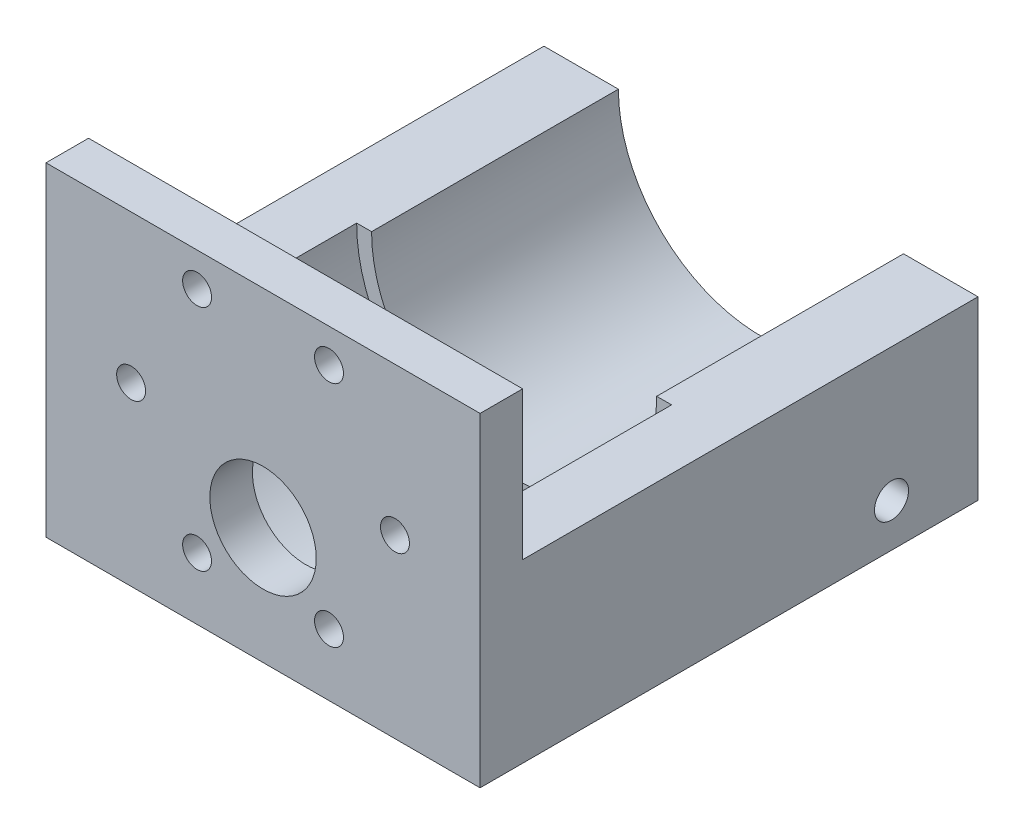
ISO-10303-21;
HEADER;
FILE_DESCRIPTION(('STEP AP214'),'2;1');
FILE_NAME('part.step','',(''),(''),'','','');
FILE_SCHEMA(('AUTOMOTIVE_DESIGN { 1 0 10303 214 1 1 1 1 }'));
ENDSEC;
DATA;
#1=APPLICATION_CONTEXT('core data for automotive mechanical design processes');
#2=APPLICATION_PROTOCOL_DEFINITION('international standard','automotive_design',2000,#1);
#3=PRODUCT_CONTEXT('',#1,'mechanical');
#4=PRODUCT('Part','Part','',(#3));
#5=PRODUCT_RELATED_PRODUCT_CATEGORY('part','',(#4));
#6=PRODUCT_DEFINITION_FORMATION('','',#4);
#7=PRODUCT_DEFINITION_CONTEXT('part definition',#1,'design');
#8=PRODUCT_DEFINITION('design','',#6,#7);
#9=PRODUCT_DEFINITION_SHAPE('','',#8);
#10=(LENGTH_UNIT() NAMED_UNIT(*) SI_UNIT(.MILLI.,.METRE.));
#11=(NAMED_UNIT(*) PLANE_ANGLE_UNIT() SI_UNIT($,.RADIAN.));
#12=(NAMED_UNIT(*) SI_UNIT($,.STERADIAN.) SOLID_ANGLE_UNIT());
#13=UNCERTAINTY_MEASURE_WITH_UNIT(LENGTH_MEASURE(1.E-05),#10,'distance_accuracy_value','');
#14=(GEOMETRIC_REPRESENTATION_CONTEXT(3) GLOBAL_UNCERTAINTY_ASSIGNED_CONTEXT((#13)) GLOBAL_UNIT_ASSIGNED_CONTEXT((#10,
#11,#12)) REPRESENTATION_CONTEXT('',''));
#15=CARTESIAN_POINT('',(0.,0.,0.));
#16=DIRECTION('',(0.,0.,1.));
#17=DIRECTION('',(1.,0.,0.));
#18=AXIS2_PLACEMENT_3D('',#15,#16,#17);
#19=CARTESIAN_POINT('',(0.,0.,24.500000006));
#20=DIRECTION('',(0.,0.,-1.));
#21=DIRECTION('',(-1.,0.,0.));
#22=AXIS2_PLACEMENT_3D('',#19,#20,#21);
#23=CYLINDRICAL_SURFACE('',#22,18.5);
#24=CARTESIAN_POINT('',(0.,0.,0.));
#25=DIRECTION('',(0.,0.,-1.));
#26=DIRECTION('',(1.,0.,0.));
#27=AXIS2_PLACEMENT_3D('',#24,#25,#26);
#28=CIRCLE('',#27,18.5);
#29=CARTESIAN_POINT('',(18.5,0.,0.));
#30=VERTEX_POINT('',#29);
#31=CARTESIAN_POINT('',(-18.5,0.,0.));
#32=VERTEX_POINT('',#31);
#33=EDGE_CURVE('E203',#30,#32,#28,.T.);
#34=ORIENTED_EDGE('',*,*,#33,.T.);
#35=DIRECTION('',(0.,0.,-1.));
#36=VECTOR('',#35,1.);
#37=CARTESIAN_POINT('',(-18.5,0.,24.500000006));
#38=LINE('',#37,#36);
#39=CARTESIAN_POINT('',(-18.5,0.,24.500000006));
#40=VERTEX_POINT('',#39);
#41=EDGE_CURVE('E11',#40,#32,#38,.T.);
#42=ORIENTED_EDGE('',*,*,#41,.F.);
#43=CARTESIAN_POINT('',(0.,0.,24.500000006));
#44=DIRECTION('',(0.,0.,-1.));
#45=DIRECTION('',(1.,0.,0.));
#46=AXIS2_PLACEMENT_3D('',#43,#44,#45);
#47=CIRCLE('',#46,18.5);
#48=CARTESIAN_POINT('',(18.5,0.,24.500000006));
#49=VERTEX_POINT('',#48);
#50=EDGE_CURVE('E204',#49,#40,#47,.T.);
#51=ORIENTED_EDGE('',*,*,#50,.F.);
#52=DIRECTION('',(0.,0.,-1.));
#53=VECTOR('',#52,1.);
#54=CARTESIAN_POINT('',(18.5,0.,24.500000006));
#55=LINE('',#54,#53);
#56=EDGE_CURVE('E213',#49,#30,#55,.T.);
#57=ORIENTED_EDGE('',*,*,#56,.T.);
#58=EDGE_LOOP('',(#34,#42,#51,#57));
#59=FACE_BOUND('',#58,.T.);
#60=ADVANCED_FACE('F37',(#59),#23,.F.);
#61=CARTESIAN_POINT('',(-25.5,0.,24.500000006));
#62=DIRECTION('',(0.,-1.,0.));
#63=DIRECTION('',(0.,0.,-1.));
#64=AXIS2_PLACEMENT_3D('',#61,#62,#63);
#65=PLANE('',#64);
#66=ORIENTED_EDGE('',*,*,#41,.T.);
#67=DIRECTION('',(1.,0.,0.));
#68=VECTOR('',#67,1.);
#69=CARTESIAN_POINT('',(-16.75,0.,0.));
#70=LINE('',#69,#68);
#71=CARTESIAN_POINT('',(-16.75,0.,0.));
#72=VERTEX_POINT('',#71);
#73=EDGE_CURVE('E128',#32,#72,#70,.T.);
#74=ORIENTED_EDGE('',*,*,#73,.T.);
#75=DIRECTION('',(0.,0.,1.));
#76=VECTOR('',#75,1.);
#77=CARTESIAN_POINT('',(-16.75,0.,-29.));
#78=LINE('',#77,#76);
#79=CARTESIAN_POINT('',(-16.75,0.,-29.));
#80=VERTEX_POINT('',#79);
#81=EDGE_CURVE('E134',#80,#72,#78,.T.);
#82=ORIENTED_EDGE('',*,*,#81,.F.);
#83=DIRECTION('',(1.,0.,0.));
#84=VECTOR('',#83,1.);
#85=CARTESIAN_POINT('',(-16.75,0.,-29.));
#86=LINE('',#85,#84);
#87=CARTESIAN_POINT('',(-25.5,0.,-29.));
#88=VERTEX_POINT('',#87);
#89=EDGE_CURVE('E124',#88,#80,#86,.T.);
#90=ORIENTED_EDGE('',*,*,#89,.F.);
#91=DIRECTION('',(0.,0.,-1.));
#92=VECTOR('',#91,1.);
#93=CARTESIAN_POINT('',(-25.5,0.,24.500000006));
#94=LINE('',#93,#92);
#95=CARTESIAN_POINT('',(-25.5,0.,24.500000006));
#96=VERTEX_POINT('',#95);
#97=EDGE_CURVE('E45',#96,#88,#94,.T.);
#98=ORIENTED_EDGE('',*,*,#97,.F.);
#99=DIRECTION('',(-1.,0.,0.));
#100=VECTOR('',#99,1.);
#101=CARTESIAN_POINT('',(-25.5,0.,24.500000006));
#102=LINE('',#101,#100);
#103=EDGE_CURVE('E207',#40,#96,#102,.T.);
#104=ORIENTED_EDGE('',*,*,#103,.F.);
#105=EDGE_LOOP('',(#66,#74,#82,#90,#98,#104));
#106=FACE_BOUND('',#105,.T.);
#107=ADVANCED_FACE('F232',(#106),#65,.F.);
#108=CARTESIAN_POINT('',(-25.5,-20.716,24.500000006));
#109=DIRECTION('',(1.,0.,0.));
#110=DIRECTION('',(0.,0.,-1.));
#111=AXIS2_PLACEMENT_3D('',#108,#109,#110);
#112=PLANE('',#111);
#113=CARTESIAN_POINT('',(-25.5,-15.636,-18.84));
#114=DIRECTION('',(-1.,0.,0.));
#115=DIRECTION('',(0.,0.,1.));
#116=AXIS2_PLACEMENT_3D('',#113,#114,#115);
#117=CIRCLE('',#116,2.000000064);
#118=CARTESIAN_POINT('',(-25.5,-15.636,-16.839999936));
#119=VERTEX_POINT('',#118);
#120=EDGE_CURVE('E289',#119,#119,#117,.T.);
#121=ORIENTED_EDGE('',*,*,#120,.F.);
#122=EDGE_LOOP('',(#121));
#123=FACE_BOUND('',#122,.T.);
#124=ORIENTED_EDGE('',*,*,#97,.T.);
#125=DIRECTION('',(0.,1.,0.));
#126=VECTOR('',#125,1.);
#127=CARTESIAN_POINT('',(-25.5,0.,-29.));
#128=LINE('',#127,#126);
#129=CARTESIAN_POINT('',(-25.5,-20.716,-29.));
#130=VERTEX_POINT('',#129);
#131=EDGE_CURVE('E225',#130,#88,#128,.T.);
#132=ORIENTED_EDGE('',*,*,#131,.F.);
#133=DIRECTION('',(0.,0.,-1.));
#134=VECTOR('',#133,1.);
#135=CARTESIAN_POINT('',(-25.5,-20.716,24.500000006));
#136=LINE('',#135,#134);
#137=CARTESIAN_POINT('',(-25.5,-20.716,29.500000006));
#138=VERTEX_POINT('',#137);
#139=EDGE_CURVE('E221',#138,#130,#136,.T.);
#140=ORIENTED_EDGE('',*,*,#139,.F.);
#141=DIRECTION('',(0.,-1.,0.));
#142=VECTOR('',#141,1.);
#143=CARTESIAN_POINT('',(-25.5,-20.716,29.500000006));
#144=LINE('',#143,#142);
#145=CARTESIAN_POINT('',(-25.5,17.384,29.500000006));
#146=VERTEX_POINT('',#145);
#147=EDGE_CURVE('E181',#146,#138,#144,.T.);
#148=ORIENTED_EDGE('',*,*,#147,.F.);
#149=DIRECTION('',(0.,0.,-1.));
#150=VECTOR('',#149,1.);
#151=CARTESIAN_POINT('',(-25.5,17.384,29.500000006));
#152=LINE('',#151,#150);
#153=CARTESIAN_POINT('',(-25.5,17.384,24.500000006));
#154=VERTEX_POINT('',#153);
#155=EDGE_CURVE('E192',#146,#154,#152,.T.);
#156=ORIENTED_EDGE('',*,*,#155,.T.);
#157=DIRECTION('',(0.,-1.,0.));
#158=VECTOR('',#157,1.);
#159=CARTESIAN_POINT('',(-25.5,-20.716,24.500000006));
#160=LINE('',#159,#158);
#161=EDGE_CURVE('E178',#154,#96,#160,.T.);
#162=ORIENTED_EDGE('',*,*,#161,.T.);
#163=EDGE_LOOP('',(#124,#132,#140,#148,#156,#162));
#164=FACE_BOUND('',#163,.T.);
#165=ADVANCED_FACE('F224',(#123,#164),#112,.F.);
#166=CARTESIAN_POINT('',(25.5,-20.716,24.500000006));
#167=DIRECTION('',(0.,1.,0.));
#168=DIRECTION('',(-1.,0.,0.));
#169=AXIS2_PLACEMENT_3D('',#166,#167,#168);
#170=PLANE('',#169);
#171=CARTESIAN_POINT('',(21.69,-20.716,25.690000006));
#172=DIRECTION('',(0.,-1.,0.));
#173=DIRECTION('',(1.,0.,0.));
#174=AXIS2_PLACEMENT_3D('',#171,#172,#173);
#175=CIRCLE('',#174,2.000000064);
#176=CARTESIAN_POINT('',(23.690000064,-20.716,25.690000006));
#177=VERTEX_POINT('',#176);
#178=EDGE_CURVE('E268',#177,#177,#175,.T.);
#179=ORIENTED_EDGE('',*,*,#178,.F.);
#180=EDGE_LOOP('',(#179));
#181=FACE_BOUND('',#180,.T.);
#182=CARTESIAN_POINT('',(-21.69,-20.716,-25.19));
#183=DIRECTION('',(0.,-1.,0.));
#184=DIRECTION('',(1.,0.,0.));
#185=AXIS2_PLACEMENT_3D('',#182,#183,#184);
#186=CIRCLE('',#185,2.000000064);
#187=CARTESIAN_POINT('',(-19.689999936,-20.716,-25.19));
#188=VERTEX_POINT('',#187);
#189=EDGE_CURVE('E274',#188,#188,#186,.T.);
#190=ORIENTED_EDGE('',*,*,#189,.F.);
#191=EDGE_LOOP('',(#190));
#192=FACE_BOUND('',#191,.T.);
#193=CARTESIAN_POINT('',(21.69,-20.716,-25.19));
#194=DIRECTION('',(0.,-1.,0.));
#195=DIRECTION('',(1.,0.,0.));
#196=AXIS2_PLACEMENT_3D('',#193,#194,#195);
#197=CIRCLE('',#196,2.000000064);
#198=CARTESIAN_POINT('',(23.690000064,-20.716,-25.19));
#199=VERTEX_POINT('',#198);
#200=EDGE_CURVE('E275',#199,#199,#197,.T.);
#201=ORIENTED_EDGE('',*,*,#200,.F.);
#202=EDGE_LOOP('',(#201));
#203=FACE_BOUND('',#202,.T.);
#204=CARTESIAN_POINT('',(-21.69,-20.716,25.690000006));
#205=DIRECTION('',(0.,-1.,0.));
#206=DIRECTION('',(1.,0.,0.));
#207=AXIS2_PLACEMENT_3D('',#204,#205,#206);
#208=CIRCLE('',#207,2.000000064);
#209=CARTESIAN_POINT('',(-19.689999936,-20.716,25.690000006));
#210=VERTEX_POINT('',#209);
#211=EDGE_CURVE('E265',#210,#210,#208,.T.);
#212=ORIENTED_EDGE('',*,*,#211,.F.);
#213=EDGE_LOOP('',(#212));
#214=FACE_BOUND('',#213,.T.);
#215=ORIENTED_EDGE('',*,*,#139,.T.);
#216=DIRECTION('',(-1.,0.,0.));
#217=VECTOR('',#216,1.);
#218=CARTESIAN_POINT('',(-25.5,-20.716,-29.));
#219=LINE('',#218,#217);
#220=CARTESIAN_POINT('',(25.5,-20.716,-29.));
#221=VERTEX_POINT('',#220);
#222=EDGE_CURVE('E230',#221,#130,#219,.T.);
#223=ORIENTED_EDGE('',*,*,#222,.F.);
#224=DIRECTION('',(0.,0.,-1.));
#225=VECTOR('',#224,1.);
#226=CARTESIAN_POINT('',(25.5,-20.716,24.500000006));
#227=LINE('',#226,#225);
#228=CARTESIAN_POINT('',(25.5,-20.716,29.500000006));
#229=VERTEX_POINT('',#228);
#230=EDGE_CURVE('E219',#229,#221,#227,.T.);
#231=ORIENTED_EDGE('',*,*,#230,.F.);
#232=DIRECTION('',(1.,0.,0.));
#233=VECTOR('',#232,1.);
#234=CARTESIAN_POINT('',(-25.5,-20.716,29.500000006));
#235=LINE('',#234,#233);
#236=EDGE_CURVE('E184',#138,#229,#235,.T.);
#237=ORIENTED_EDGE('',*,*,#236,.F.);
#238=EDGE_LOOP('',(#215,#223,#231,#237));
#239=FACE_BOUND('',#238,.T.);
#240=ADVANCED_FACE('F263',(#181,#192,#203,#214,#239),#170,.F.);
#241=CARTESIAN_POINT('',(25.5,0.,24.500000006));
#242=DIRECTION('',(-1.,0.,0.));
#243=DIRECTION('',(0.,-1.,0.));
#244=AXIS2_PLACEMENT_3D('',#241,#242,#243);
#245=PLANE('',#244);
#246=CARTESIAN_POINT('',(25.5,-15.636,-18.84));
#247=DIRECTION('',(1.,0.,0.));
#248=DIRECTION('',(0.,1.,0.));
#249=AXIS2_PLACEMENT_3D('',#246,#247,#248);
#250=CIRCLE('',#249,2.000000064);
#251=CARTESIAN_POINT('',(25.5,-13.635999936,-18.84));
#252=VERTEX_POINT('',#251);
#253=EDGE_CURVE('E295',#252,#252,#250,.T.);
#254=ORIENTED_EDGE('',*,*,#253,.F.);
#255=EDGE_LOOP('',(#254));
#256=FACE_BOUND('',#255,.T.);
#257=ORIENTED_EDGE('',*,*,#230,.T.);
#258=DIRECTION('',(0.,-1.,0.));
#259=VECTOR('',#258,1.);
#260=CARTESIAN_POINT('',(25.5,-20.716,-29.));
#261=LINE('',#260,#259);
#262=CARTESIAN_POINT('',(25.5,0.,-29.));
#263=VERTEX_POINT('',#262);
#264=EDGE_CURVE('E117',#263,#221,#261,.T.);
#265=ORIENTED_EDGE('',*,*,#264,.F.);
#266=DIRECTION('',(0.,0.,-1.));
#267=VECTOR('',#266,1.);
#268=CARTESIAN_POINT('',(25.5,0.,24.500000006));
#269=LINE('',#268,#267);
#270=CARTESIAN_POINT('',(25.5,0.,24.500000006));
#271=VERTEX_POINT('',#270);
#272=EDGE_CURVE('E52',#271,#263,#269,.T.);
#273=ORIENTED_EDGE('',*,*,#272,.F.);
#274=DIRECTION('',(0.,1.,0.));
#275=VECTOR('',#274,1.);
#276=CARTESIAN_POINT('',(25.5,-20.716,24.500000006));
#277=LINE('',#276,#275);
#278=CARTESIAN_POINT('',(25.5,17.384,24.500000006));
#279=VERTEX_POINT('',#278);
#280=EDGE_CURVE('E195',#271,#279,#277,.T.);
#281=ORIENTED_EDGE('',*,*,#280,.T.);
#282=DIRECTION('',(0.,0.,-1.));
#283=VECTOR('',#282,1.);
#284=CARTESIAN_POINT('',(25.5,17.384,29.500000006));
#285=LINE('',#284,#283);
#286=CARTESIAN_POINT('',(25.5,17.384,29.500000006));
#287=VERTEX_POINT('',#286);
#288=EDGE_CURVE('E200',#287,#279,#285,.T.);
#289=ORIENTED_EDGE('',*,*,#288,.F.);
#290=DIRECTION('',(0.,1.,0.));
#291=VECTOR('',#290,1.);
#292=CARTESIAN_POINT('',(25.5,-20.716,29.500000006));
#293=LINE('',#292,#291);
#294=EDGE_CURVE('E188',#229,#287,#293,.T.);
#295=ORIENTED_EDGE('',*,*,#294,.F.);
#296=EDGE_LOOP('',(#257,#265,#273,#281,#289,#295));
#297=FACE_BOUND('',#296,.T.);
#298=ADVANCED_FACE('F250',(#256,#297),#245,.F.);
#299=CARTESIAN_POINT('',(18.5,0.,24.500000006));
#300=DIRECTION('',(0.,-1.,0.));
#301=DIRECTION('',(0.,0.,-1.));
#302=AXIS2_PLACEMENT_3D('',#299,#300,#301);
#303=PLANE('',#302);
#304=ORIENTED_EDGE('',*,*,#272,.T.);
#305=DIRECTION('',(1.,0.,0.));
#306=VECTOR('',#305,1.);
#307=CARTESIAN_POINT('',(25.5,0.,-29.));
#308=LINE('',#307,#306);
#309=CARTESIAN_POINT('',(16.75,0.,-29.));
#310=VERTEX_POINT('',#309);
#311=EDGE_CURVE('E108',#310,#263,#308,.T.);
#312=ORIENTED_EDGE('',*,*,#311,.F.);
#313=DIRECTION('',(0.,0.,1.));
#314=VECTOR('',#313,1.);
#315=CARTESIAN_POINT('',(16.75,0.,-29.));
#316=LINE('',#315,#314);
#317=CARTESIAN_POINT('',(16.75,0.,0.));
#318=VERTEX_POINT('',#317);
#319=EDGE_CURVE('E113',#310,#318,#316,.T.);
#320=ORIENTED_EDGE('',*,*,#319,.T.);
#321=DIRECTION('',(1.,0.,0.));
#322=VECTOR('',#321,1.);
#323=CARTESIAN_POINT('',(25.5,0.,0.));
#324=LINE('',#323,#322);
#325=EDGE_CURVE('E237',#318,#30,#324,.T.);
#326=ORIENTED_EDGE('',*,*,#325,.T.);
#327=ORIENTED_EDGE('',*,*,#56,.F.);
#328=DIRECTION('',(-1.,0.,0.));
#329=VECTOR('',#328,1.);
#330=CARTESIAN_POINT('',(18.5,0.,24.500000006));
#331=LINE('',#330,#329);
#332=EDGE_CURVE('E210',#271,#49,#331,.T.);
#333=ORIENTED_EDGE('',*,*,#332,.F.);
#334=EDGE_LOOP('',(#304,#312,#320,#326,#327,#333));
#335=FACE_BOUND('',#334,.T.);
#336=ADVANCED_FACE('F110',(#335),#303,.F.);
#337=CARTESIAN_POINT('',(0.,0.,24.500000006));
#338=DIRECTION('',(0.,0.,1.));
#339=DIRECTION('',(1.,0.,0.));
#340=AXIS2_PLACEMENT_3D('',#337,#338,#339);
#341=PLANE('',#340);
#342=CARTESIAN_POINT('',(0.,-7.00000000000001,24.500000006));
#343=DIRECTION('',(0.,0.,1.));
#344=DIRECTION('',(1.,0.,0.));
#345=AXIS2_PLACEMENT_3D('',#342,#343,#344);
#346=CIRCLE('',#345,6.25);
#347=CARTESIAN_POINT('',(6.25,-7.00000000000001,24.500000006));
#348=VERTEX_POINT('',#347);
#349=EDGE_CURVE('E172',#348,#348,#346,.T.);
#350=ORIENTED_EDGE('',*,*,#349,.T.);
#351=EDGE_LOOP('',(#350));
#352=FACE_BOUND('',#351,.T.);
#353=CARTESIAN_POINT('',(15.5,0.,24.500000006));
#354=DIRECTION('',(0.,0.,1.));
#355=DIRECTION('',(1.,0.,0.));
#356=AXIS2_PLACEMENT_3D('',#353,#354,#355);
#357=CIRCLE('',#356,1.7);
#358=CARTESIAN_POINT('',(17.2,0.,24.500000006));
#359=VERTEX_POINT('',#358);
#360=EDGE_CURVE('E166',#359,#359,#357,.T.);
#361=ORIENTED_EDGE('',*,*,#360,.T.);
#362=EDGE_LOOP('',(#361));
#363=FACE_BOUND('',#362,.T.);
#364=CARTESIAN_POINT('',(-15.5,0.,24.500000006));
#365=DIRECTION('',(0.,0.,1.));
#366=DIRECTION('',(1.,0.,0.));
#367=AXIS2_PLACEMENT_3D('',#364,#365,#366);
#368=CIRCLE('',#367,1.7);
#369=CARTESIAN_POINT('',(-13.8,0.,24.500000006));
#370=VERTEX_POINT('',#369);
#371=EDGE_CURVE('E160',#370,#370,#368,.T.);
#372=ORIENTED_EDGE('',*,*,#371,.T.);
#373=EDGE_LOOP('',(#372));
#374=FACE_BOUND('',#373,.T.);
#375=CARTESIAN_POINT('',(-7.75000000000006,-13.4233937586588,24.500000006));
#376=DIRECTION('',(0.,0.,1.));
#377=DIRECTION('',(1.,0.,0.));
#378=AXIS2_PLACEMENT_3D('',#375,#376,#377);
#379=CIRCLE('',#378,1.7);
#380=CARTESIAN_POINT('',(-6.05000000000006,-13.4233937586588,24.500000006));
#381=VERTEX_POINT('',#380);
#382=EDGE_CURVE('E154',#381,#381,#379,.T.);
#383=ORIENTED_EDGE('',*,*,#382,.T.);
#384=EDGE_LOOP('',(#383));
#385=FACE_BOUND('',#384,.T.);
#386=CARTESIAN_POINT('',(-7.74999999999987,13.4233937586589,24.500000006));
#387=DIRECTION('',(0.,0.,1.));
#388=DIRECTION('',(1.,0.,0.));
#389=AXIS2_PLACEMENT_3D('',#386,#387,#388);
#390=CIRCLE('',#389,1.7);
#391=CARTESIAN_POINT('',(-6.04999999999987,13.4233937586589,24.500000006));
#392=VERTEX_POINT('',#391);
#393=EDGE_CURVE('E148',#392,#392,#390,.T.);
#394=ORIENTED_EDGE('',*,*,#393,.T.);
#395=EDGE_LOOP('',(#394));
#396=FACE_BOUND('',#395,.T.);
#397=CARTESIAN_POINT('',(7.75000000000006,13.4233937586588,24.500000006));
#398=DIRECTION('',(0.,0.,1.));
#399=DIRECTION('',(1.,0.,0.));
#400=AXIS2_PLACEMENT_3D('',#397,#398,#399);
#401=CIRCLE('',#400,1.7);
#402=CARTESIAN_POINT('',(9.45000000000006,13.4233937586588,24.500000006));
#403=VERTEX_POINT('',#402);
#404=EDGE_CURVE('E143',#403,#403,#401,.T.);
#405=ORIENTED_EDGE('',*,*,#404,.T.);
#406=EDGE_LOOP('',(#405));
#407=FACE_BOUND('',#406,.T.);
#408=CARTESIAN_POINT('',(7.74999999999987,-13.4233937586589,24.500000006));
#409=DIRECTION('',(0.,0.,1.));
#410=DIRECTION('',(1.,0.,0.));
#411=AXIS2_PLACEMENT_3D('',#408,#409,#410);
#412=CIRCLE('',#411,1.7);
#413=CARTESIAN_POINT('',(9.44999999999987,-13.4233937586589,24.500000006));
#414=VERTEX_POINT('',#413);
#415=EDGE_CURVE('E133',#414,#414,#412,.T.);
#416=ORIENTED_EDGE('',*,*,#415,.T.);
#417=EDGE_LOOP('',(#416));
#418=FACE_BOUND('',#417,.T.);
#419=ORIENTED_EDGE('',*,*,#50,.T.);
#420=ORIENTED_EDGE('',*,*,#103,.T.);
#421=ORIENTED_EDGE('',*,*,#161,.F.);
#422=DIRECTION('',(-1.,0.,0.));
#423=VECTOR('',#422,1.);
#424=CARTESIAN_POINT('',(25.5,17.384,24.500000006));
#425=LINE('',#424,#423);
#426=EDGE_CURVE('E185',#279,#154,#425,.T.);
#427=ORIENTED_EDGE('',*,*,#426,.F.);
#428=ORIENTED_EDGE('',*,*,#280,.F.);
#429=ORIENTED_EDGE('',*,*,#332,.T.);
#430=EDGE_LOOP('',(#419,#420,#421,#427,#428,#429));
#431=FACE_BOUND('',#430,.T.);
#432=ADVANCED_FACE('F246',(#352,#363,#374,#385,#396,#407,#418,#431),#341,.F.);
#433=CARTESIAN_POINT('',(0.,0.,29.500000006));
#434=DIRECTION('',(0.,0.,1.));
#435=DIRECTION('',(1.,0.,0.));
#436=AXIS2_PLACEMENT_3D('',#433,#434,#435);
#437=PLANE('',#436);
#438=CARTESIAN_POINT('',(7.75000000000006,13.4233937586588,29.500000006));
#439=DIRECTION('',(0.,0.,1.));
#440=DIRECTION('',(1.,0.,0.));
#441=AXIS2_PLACEMENT_3D('',#438,#439,#440);
#442=CIRCLE('',#441,1.7);
#443=CARTESIAN_POINT('',(9.45000000000006,13.4233937586588,29.500000006));
#444=VERTEX_POINT('',#443);
#445=EDGE_CURVE('E145',#444,#444,#442,.T.);
#446=ORIENTED_EDGE('',*,*,#445,.F.);
#447=EDGE_LOOP('',(#446));
#448=FACE_BOUND('',#447,.T.);
#449=CARTESIAN_POINT('',(-7.75000000000006,-13.4233937586588,29.500000006));
#450=DIRECTION('',(0.,0.,1.));
#451=DIRECTION('',(1.,0.,0.));
#452=AXIS2_PLACEMENT_3D('',#449,#450,#451);
#453=CIRCLE('',#452,1.7);
#454=CARTESIAN_POINT('',(-6.05000000000006,-13.4233937586588,29.500000006));
#455=VERTEX_POINT('',#454);
#456=EDGE_CURVE('E157',#455,#455,#453,.T.);
#457=ORIENTED_EDGE('',*,*,#456,.F.);
#458=EDGE_LOOP('',(#457));
#459=FACE_BOUND('',#458,.T.);
#460=CARTESIAN_POINT('',(15.5,0.,29.500000006));
#461=DIRECTION('',(0.,0.,1.));
#462=DIRECTION('',(1.,0.,0.));
#463=AXIS2_PLACEMENT_3D('',#460,#461,#462);
#464=CIRCLE('',#463,1.7);
#465=CARTESIAN_POINT('',(17.2,0.,29.500000006));
#466=VERTEX_POINT('',#465);
#467=EDGE_CURVE('E169',#466,#466,#464,.T.);
#468=ORIENTED_EDGE('',*,*,#467,.F.);
#469=EDGE_LOOP('',(#468));
#470=FACE_BOUND('',#469,.T.);
#471=ORIENTED_EDGE('',*,*,#147,.T.);
#472=ORIENTED_EDGE('',*,*,#236,.T.);
#473=ORIENTED_EDGE('',*,*,#294,.T.);
#474=DIRECTION('',(-1.,0.,0.));
#475=VECTOR('',#474,1.);
#476=CARTESIAN_POINT('',(25.5,17.384,29.500000006));
#477=LINE('',#476,#475);
#478=EDGE_CURVE('E190',#287,#146,#477,.T.);
#479=ORIENTED_EDGE('',*,*,#478,.T.);
#480=EDGE_LOOP('',(#471,#472,#473,#479));
#481=FACE_BOUND('',#480,.T.);
#482=CARTESIAN_POINT('',(0.,-7.00000000000001,29.500000006));
#483=DIRECTION('',(0.,0.,1.));
#484=DIRECTION('',(1.,0.,0.));
#485=AXIS2_PLACEMENT_3D('',#482,#483,#484);
#486=CIRCLE('',#485,6.25);
#487=CARTESIAN_POINT('',(6.25,-7.00000000000001,29.500000006));
#488=VERTEX_POINT('',#487);
#489=EDGE_CURVE('E175',#488,#488,#486,.T.);
#490=ORIENTED_EDGE('',*,*,#489,.F.);
#491=EDGE_LOOP('',(#490));
#492=FACE_BOUND('',#491,.T.);
#493=CARTESIAN_POINT('',(-15.5,0.,29.500000006));
#494=DIRECTION('',(0.,0.,1.));
#495=DIRECTION('',(1.,0.,0.));
#496=AXIS2_PLACEMENT_3D('',#493,#494,#495);
#497=CIRCLE('',#496,1.7);
#498=CARTESIAN_POINT('',(-13.8,0.,29.500000006));
#499=VERTEX_POINT('',#498);
#500=EDGE_CURVE('E163',#499,#499,#497,.T.);
#501=ORIENTED_EDGE('',*,*,#500,.F.);
#502=EDGE_LOOP('',(#501));
#503=FACE_BOUND('',#502,.T.);
#504=CARTESIAN_POINT('',(-7.74999999999987,13.4233937586589,29.500000006));
#505=DIRECTION('',(0.,0.,1.));
#506=DIRECTION('',(1.,0.,0.));
#507=AXIS2_PLACEMENT_3D('',#504,#505,#506);
#508=CIRCLE('',#507,1.7);
#509=CARTESIAN_POINT('',(-6.04999999999987,13.4233937586589,29.500000006));
#510=VERTEX_POINT('',#509);
#511=EDGE_CURVE('E151',#510,#510,#508,.T.);
#512=ORIENTED_EDGE('',*,*,#511,.F.);
#513=EDGE_LOOP('',(#512));
#514=FACE_BOUND('',#513,.T.);
#515=CARTESIAN_POINT('',(7.74999999999987,-13.4233937586589,29.500000006));
#516=DIRECTION('',(0.,0.,1.));
#517=DIRECTION('',(1.,0.,0.));
#518=AXIS2_PLACEMENT_3D('',#515,#516,#517);
#519=CIRCLE('',#518,1.7);
#520=CARTESIAN_POINT('',(9.44999999999987,-13.4233937586589,29.500000006));
#521=VERTEX_POINT('',#520);
#522=EDGE_CURVE('E137',#521,#521,#519,.T.);
#523=ORIENTED_EDGE('',*,*,#522,.F.);
#524=EDGE_LOOP('',(#523));
#525=FACE_BOUND('',#524,.T.);
#526=ADVANCED_FACE('F258',(#448,#459,#470,#481,#492,#503,#514,#525),#437,.T.);
#527=CARTESIAN_POINT('',(25.5,17.384,29.500000006));
#528=DIRECTION('',(0.,-1.,0.));
#529=DIRECTION('',(0.,0.,-1.));
#530=AXIS2_PLACEMENT_3D('',#527,#528,#529);
#531=PLANE('',#530);
#532=ORIENTED_EDGE('',*,*,#426,.T.);
#533=ORIENTED_EDGE('',*,*,#155,.F.);
#534=ORIENTED_EDGE('',*,*,#478,.F.);
#535=ORIENTED_EDGE('',*,*,#288,.T.);
#536=EDGE_LOOP('',(#532,#533,#534,#535));
#537=FACE_BOUND('',#536,.T.);
#538=ADVANCED_FACE('F254',(#537),#531,.F.);
#539=CARTESIAN_POINT('',(0.,-7.00000000000001,29.500000006));
#540=DIRECTION('',(0.,0.,-1.));
#541=DIRECTION('',(-1.,0.,0.));
#542=AXIS2_PLACEMENT_3D('',#539,#540,#541);
#543=CYLINDRICAL_SURFACE('',#542,6.25);
#544=ORIENTED_EDGE('',*,*,#489,.T.);
#545=EDGE_LOOP('',(#544));
#546=FACE_BOUND('',#545,.T.);
#547=ORIENTED_EDGE('',*,*,#349,.F.);
#548=EDGE_LOOP('',(#547));
#549=FACE_BOUND('',#548,.T.);
#550=ADVANCED_FACE('F404',(#546,#549),#543,.F.);
#551=CARTESIAN_POINT('',(15.5,0.,29.500000006));
#552=DIRECTION('',(0.,0.,-1.));
#553=DIRECTION('',(-1.,0.,0.));
#554=AXIS2_PLACEMENT_3D('',#551,#552,#553);
#555=CYLINDRICAL_SURFACE('',#554,1.7);
#556=ORIENTED_EDGE('',*,*,#467,.T.);
#557=EDGE_LOOP('',(#556));
#558=FACE_BOUND('',#557,.T.);
#559=ORIENTED_EDGE('',*,*,#360,.F.);
#560=EDGE_LOOP('',(#559));
#561=FACE_BOUND('',#560,.T.);
#562=ADVANCED_FACE('F400',(#558,#561),#555,.F.);
#563=CARTESIAN_POINT('',(-15.5,0.,29.500000006));
#564=DIRECTION('',(0.,0.,-1.));
#565=DIRECTION('',(-1.,0.,0.));
#566=AXIS2_PLACEMENT_3D('',#563,#564,#565);
#567=CYLINDRICAL_SURFACE('',#566,1.7);
#568=ORIENTED_EDGE('',*,*,#500,.T.);
#569=EDGE_LOOP('',(#568));
#570=FACE_BOUND('',#569,.T.);
#571=ORIENTED_EDGE('',*,*,#371,.F.);
#572=EDGE_LOOP('',(#571));
#573=FACE_BOUND('',#572,.T.);
#574=ADVANCED_FACE('F396',(#570,#573),#567,.F.);
#575=CARTESIAN_POINT('',(-7.75000000000006,-13.4233937586588,29.500000006));
#576=DIRECTION('',(0.,0.,-1.));
#577=DIRECTION('',(-1.,0.,0.));
#578=AXIS2_PLACEMENT_3D('',#575,#576,#577);
#579=CYLINDRICAL_SURFACE('',#578,1.7);
#580=ORIENTED_EDGE('',*,*,#456,.T.);
#581=EDGE_LOOP('',(#580));
#582=FACE_BOUND('',#581,.T.);
#583=ORIENTED_EDGE('',*,*,#382,.F.);
#584=EDGE_LOOP('',(#583));
#585=FACE_BOUND('',#584,.T.);
#586=ADVANCED_FACE('F392',(#582,#585),#579,.F.);
#587=CARTESIAN_POINT('',(-7.74999999999987,13.4233937586589,29.500000006));
#588=DIRECTION('',(0.,0.,-1.));
#589=DIRECTION('',(-1.,0.,0.));
#590=AXIS2_PLACEMENT_3D('',#587,#588,#589);
#591=CYLINDRICAL_SURFACE('',#590,1.7);
#592=ORIENTED_EDGE('',*,*,#511,.T.);
#593=EDGE_LOOP('',(#592));
#594=FACE_BOUND('',#593,.T.);
#595=ORIENTED_EDGE('',*,*,#393,.F.);
#596=EDGE_LOOP('',(#595));
#597=FACE_BOUND('',#596,.T.);
#598=ADVANCED_FACE('F388',(#594,#597),#591,.F.);
#599=CARTESIAN_POINT('',(7.75000000000006,13.4233937586588,29.500000006));
#600=DIRECTION('',(0.,0.,-1.));
#601=DIRECTION('',(-1.,0.,0.));
#602=AXIS2_PLACEMENT_3D('',#599,#600,#601);
#603=CYLINDRICAL_SURFACE('',#602,1.7);
#604=ORIENTED_EDGE('',*,*,#445,.T.);
#605=EDGE_LOOP('',(#604));
#606=FACE_BOUND('',#605,.T.);
#607=ORIENTED_EDGE('',*,*,#404,.F.);
#608=EDGE_LOOP('',(#607));
#609=FACE_BOUND('',#608,.T.);
#610=ADVANCED_FACE('F384',(#606,#609),#603,.F.);
#611=CARTESIAN_POINT('',(7.74999999999987,-13.4233937586589,29.500000006));
#612=DIRECTION('',(0.,0.,-1.));
#613=DIRECTION('',(-1.,0.,0.));
#614=AXIS2_PLACEMENT_3D('',#611,#612,#613);
#615=CYLINDRICAL_SURFACE('',#614,1.7);
#616=ORIENTED_EDGE('',*,*,#522,.T.);
#617=EDGE_LOOP('',(#616));
#618=FACE_BOUND('',#617,.T.);
#619=ORIENTED_EDGE('',*,*,#415,.F.);
#620=EDGE_LOOP('',(#619));
#621=FACE_BOUND('',#620,.T.);
#622=ADVANCED_FACE('F379',(#618,#621),#615,.F.);
#623=CARTESIAN_POINT('',(0.,0.,0.));
#624=DIRECTION('',(0.,0.,-1.));
#625=DIRECTION('',(-1.,0.,0.));
#626=AXIS2_PLACEMENT_3D('',#623,#624,#625);
#627=PLANE('',#626);
#628=ORIENTED_EDGE('',*,*,#33,.F.);
#629=ORIENTED_EDGE('',*,*,#325,.F.);
#630=CARTESIAN_POINT('',(0.,0.,0.));
#631=DIRECTION('',(0.,0.,1.));
#632=DIRECTION('',(-1.,0.,0.));
#633=AXIS2_PLACEMENT_3D('',#630,#631,#632);
#634=CIRCLE('',#633,16.75);
#635=EDGE_CURVE('E132',#72,#318,#634,.T.);
#636=ORIENTED_EDGE('',*,*,#635,.F.);
#637=ORIENTED_EDGE('',*,*,#73,.F.);
#638=EDGE_LOOP('',(#628,#629,#636,#637));
#639=FACE_BOUND('',#638,.T.);
#640=ADVANCED_FACE('F242',(#639),#627,.F.);
#641=CARTESIAN_POINT('',(0.,0.,-29.));
#642=DIRECTION('',(0.,0.,1.));
#643=DIRECTION('',(1.,0.,0.));
#644=AXIS2_PLACEMENT_3D('',#641,#642,#643);
#645=CYLINDRICAL_SURFACE('',#644,16.75);
#646=ORIENTED_EDGE('',*,*,#635,.T.);
#647=ORIENTED_EDGE('',*,*,#319,.F.);
#648=CARTESIAN_POINT('',(0.,0.,-29.));
#649=DIRECTION('',(0.,0.,1.));
#650=DIRECTION('',(-1.,0.,0.));
#651=AXIS2_PLACEMENT_3D('',#648,#649,#650);
#652=CIRCLE('',#651,16.75);
#653=EDGE_CURVE('E118',#80,#310,#652,.T.);
#654=ORIENTED_EDGE('',*,*,#653,.F.);
#655=ORIENTED_EDGE('',*,*,#81,.T.);
#656=EDGE_LOOP('',(#646,#647,#654,#655));
#657=FACE_BOUND('',#656,.T.);
#658=ADVANCED_FACE('F130',(#657),#645,.F.);
#659=CARTESIAN_POINT('',(0.,0.,-29.));
#660=DIRECTION('',(0.,0.,-1.));
#661=DIRECTION('',(-1.,0.,0.));
#662=AXIS2_PLACEMENT_3D('',#659,#660,#661);
#663=PLANE('',#662);
#664=ORIENTED_EDGE('',*,*,#653,.T.);
#665=ORIENTED_EDGE('',*,*,#311,.T.);
#666=ORIENTED_EDGE('',*,*,#264,.T.);
#667=ORIENTED_EDGE('',*,*,#222,.T.);
#668=ORIENTED_EDGE('',*,*,#131,.T.);
#669=ORIENTED_EDGE('',*,*,#89,.T.);
#670=EDGE_LOOP('',(#664,#665,#666,#667,#668,#669));
#671=FACE_BOUND('',#670,.T.);
#672=ADVANCED_FACE('F121',(#671),#663,.T.);
#673=CARTESIAN_POINT('',(-21.69,-13.71600003,25.690000006));
#674=DIRECTION('',(0.,-1.,0.));
#675=DIRECTION('',(1.,0.,0.));
#676=AXIS2_PLACEMENT_3D('',#673,#674,#675);
#677=CYLINDRICAL_SURFACE('',#676,2.000000064);
#678=CARTESIAN_POINT('',(-21.69,-13.71600003,25.690000006));
#679=DIRECTION('',(0.,-1.,0.));
#680=DIRECTION('',(1.,0.,0.));
#681=AXIS2_PLACEMENT_3D('',#678,#679,#680);
#682=CIRCLE('',#681,2.000000064);
#683=CARTESIAN_POINT('',(-19.689999936,-13.71600003,25.690000006));
#684=VERTEX_POINT('',#683);
#685=EDGE_CURVE('E238',#684,#684,#682,.T.);
#686=ORIENTED_EDGE('',*,*,#685,.F.);
#687=EDGE_LOOP('',(#686));
#688=FACE_BOUND('',#687,.T.);
#689=ORIENTED_EDGE('',*,*,#211,.T.);
#690=EDGE_LOOP('',(#689));
#691=FACE_BOUND('',#690,.T.);
#692=ADVANCED_FACE('F370',(#688,#691),#677,.F.);
#693=CARTESIAN_POINT('',(-21.69,-13.71600003,25.690000006));
#694=DIRECTION('',(0.,-1.,0.));
#695=DIRECTION('',(1.,0.,0.));
#696=AXIS2_PLACEMENT_3D('',#693,#694,#695);
#697=PLANE('',#696);
#698=ORIENTED_EDGE('',*,*,#685,.T.);
#699=EDGE_LOOP('',(#698));
#700=FACE_BOUND('',#699,.T.);
#701=ADVANCED_FACE('F352',(#700),#697,.T.);
#702=CARTESIAN_POINT('',(21.69,-13.71600003,-25.19));
#703=DIRECTION('',(0.,-1.,0.));
#704=DIRECTION('',(1.,0.,0.));
#705=AXIS2_PLACEMENT_3D('',#702,#703,#704);
#706=CYLINDRICAL_SURFACE('',#705,2.000000064);
#707=CARTESIAN_POINT('',(21.69,-13.71600003,-25.19));
#708=DIRECTION('',(0.,-1.,0.));
#709=DIRECTION('',(1.,0.,0.));
#710=AXIS2_PLACEMENT_3D('',#707,#708,#709);
#711=CIRCLE('',#710,2.000000064);
#712=CARTESIAN_POINT('',(23.690000064,-13.71600003,-25.19));
#713=VERTEX_POINT('',#712);
#714=EDGE_CURVE('E283',#713,#713,#711,.T.);
#715=ORIENTED_EDGE('',*,*,#714,.F.);
#716=EDGE_LOOP('',(#715));
#717=FACE_BOUND('',#716,.T.);
#718=ORIENTED_EDGE('',*,*,#200,.T.);
#719=EDGE_LOOP('',(#718));
#720=FACE_BOUND('',#719,.T.);
#721=ADVANCED_FACE('F348',(#717,#720),#706,.F.);
#722=CARTESIAN_POINT('',(21.69,-13.71600003,-25.19));
#723=DIRECTION('',(0.,-1.,0.));
#724=DIRECTION('',(1.,0.,0.));
#725=AXIS2_PLACEMENT_3D('',#722,#723,#724);
#726=PLANE('',#725);
#727=ORIENTED_EDGE('',*,*,#714,.T.);
#728=EDGE_LOOP('',(#727));
#729=FACE_BOUND('',#728,.T.);
#730=ADVANCED_FACE('F351',(#729),#726,.T.);
#731=CARTESIAN_POINT('',(-21.69,-13.71600003,-25.19));
#732=DIRECTION('',(0.,-1.,0.));
#733=DIRECTION('',(1.,0.,0.));
#734=AXIS2_PLACEMENT_3D('',#731,#732,#733);
#735=CYLINDRICAL_SURFACE('',#734,2.000000064);
#736=CARTESIAN_POINT('',(-21.69,-13.71600003,-25.19));
#737=DIRECTION('',(0.,-1.,0.));
#738=DIRECTION('',(1.,0.,0.));
#739=AXIS2_PLACEMENT_3D('',#736,#737,#738);
#740=CIRCLE('',#739,2.000000064);
#741=CARTESIAN_POINT('',(-19.689999936,-13.71600003,-25.19));
#742=VERTEX_POINT('',#741);
#743=EDGE_CURVE('E271',#742,#742,#740,.T.);
#744=ORIENTED_EDGE('',*,*,#743,.F.);
#745=EDGE_LOOP('',(#744));
#746=FACE_BOUND('',#745,.T.);
#747=ORIENTED_EDGE('',*,*,#189,.T.);
#748=EDGE_LOOP('',(#747));
#749=FACE_BOUND('',#748,.T.);
#750=ADVANCED_FACE('F356',(#746,#749),#735,.F.);
#751=CARTESIAN_POINT('',(-21.69,-13.71600003,-25.19));
#752=DIRECTION('',(0.,-1.,0.));
#753=DIRECTION('',(1.,0.,0.));
#754=AXIS2_PLACEMENT_3D('',#751,#752,#753);
#755=PLANE('',#754);
#756=ORIENTED_EDGE('',*,*,#743,.T.);
#757=EDGE_LOOP('',(#756));
#758=FACE_BOUND('',#757,.T.);
#759=ADVANCED_FACE('F359',(#758),#755,.T.);
#760=CARTESIAN_POINT('',(21.69,-13.71600003,25.690000006));
#761=DIRECTION('',(0.,-1.,0.));
#762=DIRECTION('',(1.,0.,0.));
#763=AXIS2_PLACEMENT_3D('',#760,#761,#762);
#764=CYLINDRICAL_SURFACE('',#763,2.000000064);
#765=CARTESIAN_POINT('',(21.69,-13.71600003,25.690000006));
#766=DIRECTION('',(0.,-1.,0.));
#767=DIRECTION('',(1.,0.,0.));
#768=AXIS2_PLACEMENT_3D('',#765,#766,#767);
#769=CIRCLE('',#768,2.000000064);
#770=CARTESIAN_POINT('',(23.690000064,-13.71600003,25.690000006));
#771=VERTEX_POINT('',#770);
#772=EDGE_CURVE('E278',#771,#771,#769,.T.);
#773=ORIENTED_EDGE('',*,*,#772,.F.);
#774=EDGE_LOOP('',(#773));
#775=FACE_BOUND('',#774,.T.);
#776=ORIENTED_EDGE('',*,*,#178,.T.);
#777=EDGE_LOOP('',(#776));
#778=FACE_BOUND('',#777,.T.);
#779=ADVANCED_FACE('F343',(#775,#778),#764,.F.);
#780=CARTESIAN_POINT('',(21.69,-13.71600003,25.690000006));
#781=DIRECTION('',(0.,-1.,0.));
#782=DIRECTION('',(1.,0.,0.));
#783=AXIS2_PLACEMENT_3D('',#780,#781,#782);
#784=PLANE('',#783);
#785=ORIENTED_EDGE('',*,*,#772,.T.);
#786=EDGE_LOOP('',(#785));
#787=FACE_BOUND('',#786,.T.);
#788=ADVANCED_FACE('F334',(#787),#784,.T.);
#789=CARTESIAN_POINT('',(-18.50000003,-15.636,-18.84));
#790=DIRECTION('',(-1.,0.,0.));
#791=DIRECTION('',(0.,0.,1.));
#792=AXIS2_PLACEMENT_3D('',#789,#790,#791);
#793=CYLINDRICAL_SURFACE('',#792,2.000000064);
#794=CARTESIAN_POINT('',(-18.50000003,-15.636,-18.84));
#795=DIRECTION('',(-1.,0.,0.));
#796=DIRECTION('',(0.,0.,1.));
#797=AXIS2_PLACEMENT_3D('',#794,#795,#796);
#798=CIRCLE('',#797,2.000000064);
#799=CARTESIAN_POINT('',(-18.50000003,-15.636,-16.839999936));
#800=VERTEX_POINT('',#799);
#801=EDGE_CURVE('E286',#800,#800,#798,.T.);
#802=ORIENTED_EDGE('',*,*,#801,.F.);
#803=EDGE_LOOP('',(#802));
#804=FACE_BOUND('',#803,.T.);
#805=ORIENTED_EDGE('',*,*,#120,.T.);
#806=EDGE_LOOP('',(#805));
#807=FACE_BOUND('',#806,.T.);
#808=ADVANCED_FACE('F332',(#804,#807),#793,.F.);
#809=CARTESIAN_POINT('',(-18.50000003,-15.636,-18.84));
#810=DIRECTION('',(-1.,0.,0.));
#811=DIRECTION('',(0.,0.,1.));
#812=AXIS2_PLACEMENT_3D('',#809,#810,#811);
#813=PLANE('',#812);
#814=ORIENTED_EDGE('',*,*,#801,.T.);
#815=EDGE_LOOP('',(#814));
#816=FACE_BOUND('',#815,.T.);
#817=ADVANCED_FACE('F306',(#816),#813,.T.);
#818=CARTESIAN_POINT('',(18.50000003,-15.636,-18.84));
#819=DIRECTION('',(1.,0.,0.));
#820=DIRECTION('',(0.,1.,0.));
#821=AXIS2_PLACEMENT_3D('',#818,#819,#820);
#822=CYLINDRICAL_SURFACE('',#821,2.000000064);
#823=CARTESIAN_POINT('',(18.50000003,-15.636,-18.84));
#824=DIRECTION('',(1.,0.,0.));
#825=DIRECTION('',(0.,1.,0.));
#826=AXIS2_PLACEMENT_3D('',#823,#824,#825);
#827=CIRCLE('',#826,2.000000064);
#828=CARTESIAN_POINT('',(18.50000003,-13.635999936,-18.84));
#829=VERTEX_POINT('',#828);
#830=EDGE_CURVE('E292',#829,#829,#827,.T.);
#831=ORIENTED_EDGE('',*,*,#830,.F.);
#832=EDGE_LOOP('',(#831));
#833=FACE_BOUND('',#832,.T.);
#834=ORIENTED_EDGE('',*,*,#253,.T.);
#835=EDGE_LOOP('',(#834));
#836=FACE_BOUND('',#835,.T.);
#837=ADVANCED_FACE('F303',(#833,#836),#822,.F.);
#838=CARTESIAN_POINT('',(18.50000003,-15.636,-18.84));
#839=DIRECTION('',(1.,0.,0.));
#840=DIRECTION('',(0.,1.,0.));
#841=AXIS2_PLACEMENT_3D('',#838,#839,#840);
#842=PLANE('',#841);
#843=ORIENTED_EDGE('',*,*,#830,.T.);
#844=EDGE_LOOP('',(#843));
#845=FACE_BOUND('',#844,.T.);
#846=ADVANCED_FACE('F301',(#845),#842,.T.);
#847=CLOSED_SHELL('',(#60,#107,#165,#240,#298,#336,#432,#526,#538,#550,#562,#574,#586,#598,#610,
#622,#640,#658,#672,#692,#701,#721,#730,#750,#759,#779,#788,#808,#817,#837,#846));
#848=MANIFOLD_SOLID_BREP('B2',#847);
#849=ADVANCED_BREP_SHAPE_REPRESENTATION('',(#18,#848),#14);
#850=SHAPE_DEFINITION_REPRESENTATION(#9,#849);
ENDSEC;
END-ISO-10303-21;
